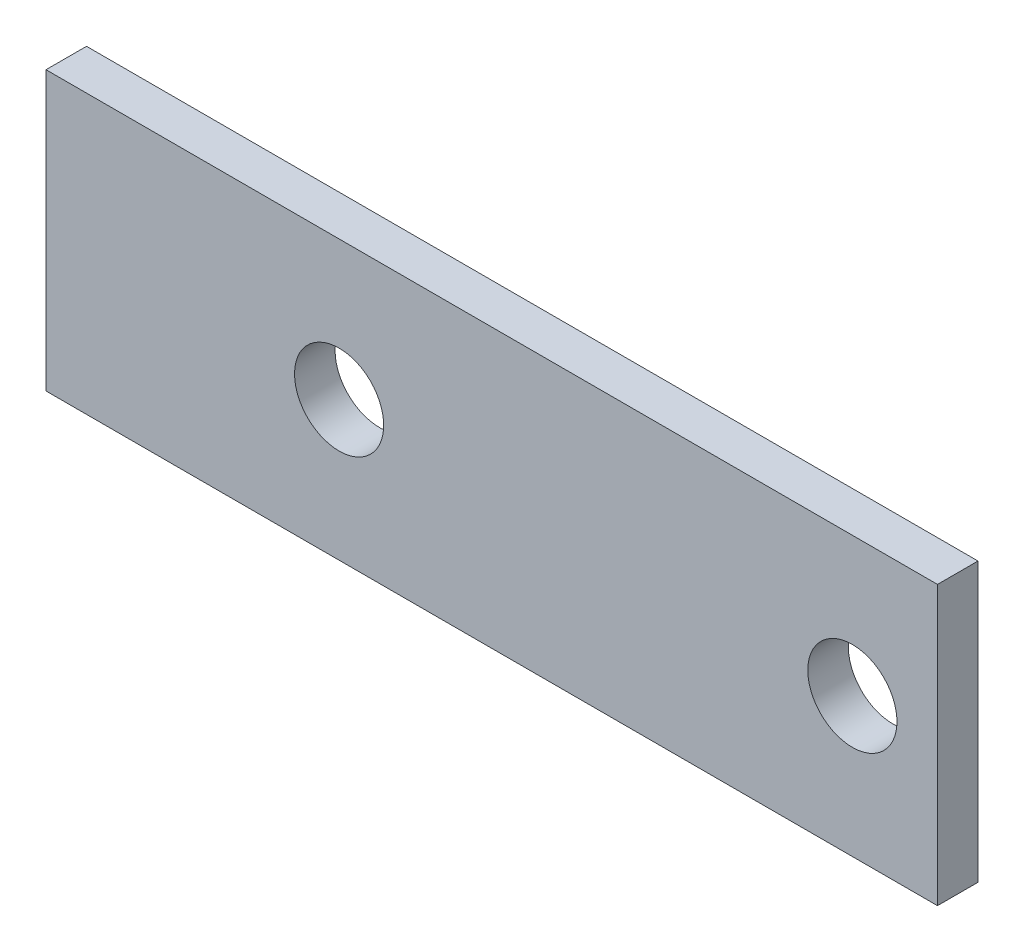
ISO-10303-21;
HEADER;
FILE_DESCRIPTION(('STEP AP214'),'2;1');
FILE_NAME('part.step','',(''),(''),'','','');
FILE_SCHEMA(('AUTOMOTIVE_DESIGN { 1 0 10303 214 1 1 1 1 }'));
ENDSEC;
DATA;
#1=APPLICATION_CONTEXT('core data for automotive mechanical design processes');
#2=APPLICATION_PROTOCOL_DEFINITION('international standard','automotive_design',2000,#1);
#3=PRODUCT_CONTEXT('',#1,'mechanical');
#4=PRODUCT('Part','Part','',(#3));
#5=PRODUCT_RELATED_PRODUCT_CATEGORY('part','',(#4));
#6=PRODUCT_DEFINITION_FORMATION('','',#4);
#7=PRODUCT_DEFINITION_CONTEXT('part definition',#1,'design');
#8=PRODUCT_DEFINITION('design','',#6,#7);
#9=PRODUCT_DEFINITION_SHAPE('','',#8);
#10=(LENGTH_UNIT() NAMED_UNIT(*) SI_UNIT(.MILLI.,.METRE.));
#11=(NAMED_UNIT(*) PLANE_ANGLE_UNIT() SI_UNIT($,.RADIAN.));
#12=(NAMED_UNIT(*) SI_UNIT($,.STERADIAN.) SOLID_ANGLE_UNIT());
#13=UNCERTAINTY_MEASURE_WITH_UNIT(LENGTH_MEASURE(1.E-05),#10,'distance_accuracy_value','');
#14=(GEOMETRIC_REPRESENTATION_CONTEXT(3) GLOBAL_UNCERTAINTY_ASSIGNED_CONTEXT((#13)) GLOBAL_UNIT_ASSIGNED_CONTEXT((#10,
#11,#12)) REPRESENTATION_CONTEXT('',''));
#15=CARTESIAN_POINT('',(0.,0.,0.));
#16=DIRECTION('',(0.,0.,1.));
#17=DIRECTION('',(1.,0.,0.));
#18=AXIS2_PLACEMENT_3D('',#15,#16,#17);
#19=CARTESIAN_POINT('',(0.,0.,0.));
#20=DIRECTION('',(0.,0.,1.));
#21=DIRECTION('',(1.,0.,0.));
#22=AXIS2_PLACEMENT_3D('',#19,#20,#21);
#23=PLANE('',#22);
#24=CARTESIAN_POINT('',(13.35,0.,0.));
#25=DIRECTION('',(0.,0.,-1.));
#26=DIRECTION('',(-1.,0.,0.));
#27=AXIS2_PLACEMENT_3D('',#24,#25,#26);
#28=CIRCLE('',#27,1.65);
#29=CARTESIAN_POINT('',(11.7,0.,0.));
#30=VERTEX_POINT('',#29);
#31=EDGE_CURVE('E84',#30,#30,#28,.F.);
#32=ORIENTED_EDGE('',*,*,#31,.T.);
#33=EDGE_LOOP('',(#32));
#34=FACE_BOUND('',#33,.T.);
#35=CARTESIAN_POINT('',(-5.65,0.,0.));
#36=DIRECTION('',(0.,0.,-1.));
#37=DIRECTION('',(-1.,0.,0.));
#38=AXIS2_PLACEMENT_3D('',#35,#36,#37);
#39=CIRCLE('',#38,1.65);
#40=CARTESIAN_POINT('',(-7.3,0.,0.));
#41=VERTEX_POINT('',#40);
#42=EDGE_CURVE('E20',#41,#41,#39,.F.);
#43=ORIENTED_EDGE('',*,*,#42,.T.);
#44=EDGE_LOOP('',(#43));
#45=FACE_BOUND('',#44,.T.);
#46=DIRECTION('',(0.,1.,0.));
#47=VECTOR('',#46,1.);
#48=CARTESIAN_POINT('',(-16.5,5.15,0.));
#49=LINE('',#48,#47);
#50=CARTESIAN_POINT('',(-16.5,5.15,0.));
#51=VERTEX_POINT('',#50);
#52=CARTESIAN_POINT('',(-16.5,-5.15,0.));
#53=VERTEX_POINT('',#52);
#54=EDGE_CURVE('E95',#51,#53,#49,.F.);
#55=ORIENTED_EDGE('',*,*,#54,.F.);
#56=DIRECTION('',(1.,0.,0.));
#57=VECTOR('',#56,1.);
#58=CARTESIAN_POINT('',(16.5,5.15,0.));
#59=LINE('',#58,#57);
#60=CARTESIAN_POINT('',(16.5,5.15,0.));
#61=VERTEX_POINT('',#60);
#62=EDGE_CURVE('E55',#61,#51,#59,.F.);
#63=ORIENTED_EDGE('',*,*,#62,.F.);
#64=DIRECTION('',(0.,1.,0.));
#65=VECTOR('',#64,1.);
#66=CARTESIAN_POINT('',(16.5,-5.15,0.));
#67=LINE('',#66,#65);
#68=CARTESIAN_POINT('',(16.5,-5.15,0.));
#69=VERTEX_POINT('',#68);
#70=EDGE_CURVE('E57',#69,#61,#67,.T.);
#71=ORIENTED_EDGE('',*,*,#70,.F.);
#72=DIRECTION('',(1.,0.,0.));
#73=VECTOR('',#72,1.);
#74=CARTESIAN_POINT('',(-16.5,-5.15,0.));
#75=LINE('',#74,#73);
#76=EDGE_CURVE('E59',#53,#69,#75,.T.);
#77=ORIENTED_EDGE('',*,*,#76,.F.);
#78=EDGE_LOOP('',(#55,#63,#71,#77));
#79=FACE_BOUND('',#78,.T.);
#80=ADVANCED_FACE('F17',(#34,#45,#79),#23,.F.);
#81=CARTESIAN_POINT('',(-16.5,-5.15,0.));
#82=DIRECTION('',(0.,-1.,0.));
#83=DIRECTION('',(1.,0.,0.));
#84=AXIS2_PLACEMENT_3D('',#81,#82,#83);
#85=PLANE('',#84);
#86=DIRECTION('',(1.,0.,0.));
#87=VECTOR('',#86,1.);
#88=CARTESIAN_POINT('',(0.,-5.15,1.5));
#89=LINE('',#88,#87);
#90=CARTESIAN_POINT('',(-16.5,-5.15,1.5));
#91=VERTEX_POINT('',#90);
#92=CARTESIAN_POINT('',(16.5,-5.15,1.5));
#93=VERTEX_POINT('',#92);
#94=EDGE_CURVE('E86',#91,#93,#89,.T.);
#95=ORIENTED_EDGE('',*,*,#94,.F.);
#96=DIRECTION('',(0.,0.,1.));
#97=VECTOR('',#96,1.);
#98=CARTESIAN_POINT('',(-16.5,-5.15,0.));
#99=LINE('',#98,#97);
#100=EDGE_CURVE('E70',#53,#91,#99,.T.);
#101=ORIENTED_EDGE('',*,*,#100,.F.);
#102=ORIENTED_EDGE('',*,*,#76,.T.);
#103=DIRECTION('',(0.,0.,-1.));
#104=VECTOR('',#103,1.);
#105=CARTESIAN_POINT('',(16.5,-5.15,0.));
#106=LINE('',#105,#104);
#107=EDGE_CURVE('E64',#93,#69,#106,.T.);
#108=ORIENTED_EDGE('',*,*,#107,.F.);
#109=EDGE_LOOP('',(#95,#101,#102,#108));
#110=FACE_BOUND('',#109,.T.);
#111=ADVANCED_FACE('F67',(#110),#85,.T.);
#112=CARTESIAN_POINT('',(16.5,-5.15,0.));
#113=DIRECTION('',(1.,0.,0.));
#114=DIRECTION('',(0.,0.,-1.));
#115=AXIS2_PLACEMENT_3D('',#112,#113,#114);
#116=PLANE('',#115);
#117=DIRECTION('',(0.,1.,0.));
#118=VECTOR('',#117,1.);
#119=CARTESIAN_POINT('',(16.5,0.,1.5));
#120=LINE('',#119,#118);
#121=CARTESIAN_POINT('',(16.5,5.15,1.5));
#122=VERTEX_POINT('',#121);
#123=EDGE_CURVE('E75',#93,#122,#120,.T.);
#124=ORIENTED_EDGE('',*,*,#123,.F.);
#125=ORIENTED_EDGE('',*,*,#107,.T.);
#126=ORIENTED_EDGE('',*,*,#70,.T.);
#127=DIRECTION('',(0.,0.,1.));
#128=VECTOR('',#127,1.);
#129=CARTESIAN_POINT('',(16.5,5.15,0.));
#130=LINE('',#129,#128);
#131=EDGE_CURVE('E78',#122,#61,#130,.F.);
#132=ORIENTED_EDGE('',*,*,#131,.F.);
#133=EDGE_LOOP('',(#124,#125,#126,#132));
#134=FACE_BOUND('',#133,.T.);
#135=ADVANCED_FACE('F73',(#134),#116,.T.);
#136=CARTESIAN_POINT('',(16.5,5.15,0.));
#137=DIRECTION('',(0.,1.,0.));
#138=DIRECTION('',(0.,0.,1.));
#139=AXIS2_PLACEMENT_3D('',#136,#137,#138);
#140=PLANE('',#139);
#141=DIRECTION('',(1.,0.,0.));
#142=VECTOR('',#141,1.);
#143=CARTESIAN_POINT('',(0.,5.15,1.5));
#144=LINE('',#143,#142);
#145=CARTESIAN_POINT('',(-16.5,5.15,1.5));
#146=VERTEX_POINT('',#145);
#147=EDGE_CURVE('E101',#122,#146,#144,.F.);
#148=ORIENTED_EDGE('',*,*,#147,.F.);
#149=ORIENTED_EDGE('',*,*,#131,.T.);
#150=ORIENTED_EDGE('',*,*,#62,.T.);
#151=DIRECTION('',(0.,0.,1.));
#152=VECTOR('',#151,1.);
#153=CARTESIAN_POINT('',(-16.5,5.15,0.));
#154=LINE('',#153,#152);
#155=EDGE_CURVE('E35',#146,#51,#154,.F.);
#156=ORIENTED_EDGE('',*,*,#155,.F.);
#157=EDGE_LOOP('',(#148,#149,#150,#156));
#158=FACE_BOUND('',#157,.T.);
#159=ADVANCED_FACE('F99',(#158),#140,.T.);
#160=CARTESIAN_POINT('',(-16.5,5.15,0.));
#161=DIRECTION('',(-1.,0.,0.));
#162=DIRECTION('',(0.,0.,1.));
#163=AXIS2_PLACEMENT_3D('',#160,#161,#162);
#164=PLANE('',#163);
#165=DIRECTION('',(0.,1.,0.));
#166=VECTOR('',#165,1.);
#167=CARTESIAN_POINT('',(-16.5,0.,1.5));
#168=LINE('',#167,#166);
#169=EDGE_CURVE('E83',#146,#91,#168,.F.);
#170=ORIENTED_EDGE('',*,*,#169,.F.);
#171=ORIENTED_EDGE('',*,*,#155,.T.);
#172=ORIENTED_EDGE('',*,*,#54,.T.);
#173=ORIENTED_EDGE('',*,*,#100,.T.);
#174=EDGE_LOOP('',(#170,#171,#172,#173));
#175=FACE_BOUND('',#174,.T.);
#176=ADVANCED_FACE('F107',(#175),#164,.T.);
#177=CARTESIAN_POINT('',(-5.65,0.,1.5));
#178=DIRECTION('',(0.,0.,-1.));
#179=DIRECTION('',(-1.,0.,0.));
#180=AXIS2_PLACEMENT_3D('',#177,#178,#179);
#181=CYLINDRICAL_SURFACE('',#180,1.65);
#182=CARTESIAN_POINT('',(-5.65,0.,1.5));
#183=DIRECTION('',(0.,0.,-1.));
#184=DIRECTION('',(-1.,0.,0.));
#185=AXIS2_PLACEMENT_3D('',#182,#183,#184);
#186=CIRCLE('',#185,1.65);
#187=CARTESIAN_POINT('',(-7.3,0.,1.5));
#188=VERTEX_POINT('',#187);
#189=EDGE_CURVE('E26',#188,#188,#186,.T.);
#190=ORIENTED_EDGE('',*,*,#189,.F.);
#191=EDGE_LOOP('',(#190));
#192=FACE_BOUND('',#191,.T.);
#193=ORIENTED_EDGE('',*,*,#42,.F.);
#194=EDGE_LOOP('',(#193));
#195=FACE_BOUND('',#194,.T.);
#196=ADVANCED_FACE('F109',(#192,#195),#181,.F.);
#197=CARTESIAN_POINT('',(13.35,0.,1.5));
#198=DIRECTION('',(0.,0.,-1.));
#199=DIRECTION('',(-1.,0.,0.));
#200=AXIS2_PLACEMENT_3D('',#197,#198,#199);
#201=CYLINDRICAL_SURFACE('',#200,1.65);
#202=CARTESIAN_POINT('',(13.35,0.,1.5));
#203=DIRECTION('',(0.,0.,-1.));
#204=DIRECTION('',(-1.,0.,0.));
#205=AXIS2_PLACEMENT_3D('',#202,#203,#204);
#206=CIRCLE('',#205,1.65);
#207=CARTESIAN_POINT('',(11.7,0.,1.5));
#208=VERTEX_POINT('',#207);
#209=EDGE_CURVE('E11',#208,#208,#206,.T.);
#210=ORIENTED_EDGE('',*,*,#209,.F.);
#211=EDGE_LOOP('',(#210));
#212=FACE_BOUND('',#211,.T.);
#213=ORIENTED_EDGE('',*,*,#31,.F.);
#214=EDGE_LOOP('',(#213));
#215=FACE_BOUND('',#214,.T.);
#216=ADVANCED_FACE('F116',(#212,#215),#201,.F.);
#217=CARTESIAN_POINT('',(0.,0.,1.5));
#218=DIRECTION('',(0.,0.,1.));
#219=DIRECTION('',(1.,0.,0.));
#220=AXIS2_PLACEMENT_3D('',#217,#218,#219);
#221=PLANE('',#220);
#222=ORIENTED_EDGE('',*,*,#209,.T.);
#223=EDGE_LOOP('',(#222));
#224=FACE_BOUND('',#223,.T.);
#225=ORIENTED_EDGE('',*,*,#189,.T.);
#226=EDGE_LOOP('',(#225));
#227=FACE_BOUND('',#226,.T.);
#228=ORIENTED_EDGE('',*,*,#147,.T.);
#229=ORIENTED_EDGE('',*,*,#169,.T.);
#230=ORIENTED_EDGE('',*,*,#94,.T.);
#231=ORIENTED_EDGE('',*,*,#123,.T.);
#232=EDGE_LOOP('',(#228,#229,#230,#231));
#233=FACE_BOUND('',#232,.T.);
#234=ADVANCED_FACE('F105',(#224,#227,#233),#221,.T.);
#235=CLOSED_SHELL('',(#80,#111,#135,#159,#176,#196,#216,#234));
#236=MANIFOLD_SOLID_BREP('B1',#235);
#237=ADVANCED_BREP_SHAPE_REPRESENTATION('',(#18,#236),#14);
#238=SHAPE_DEFINITION_REPRESENTATION(#9,#237);
ENDSEC;
END-ISO-10303-21;
